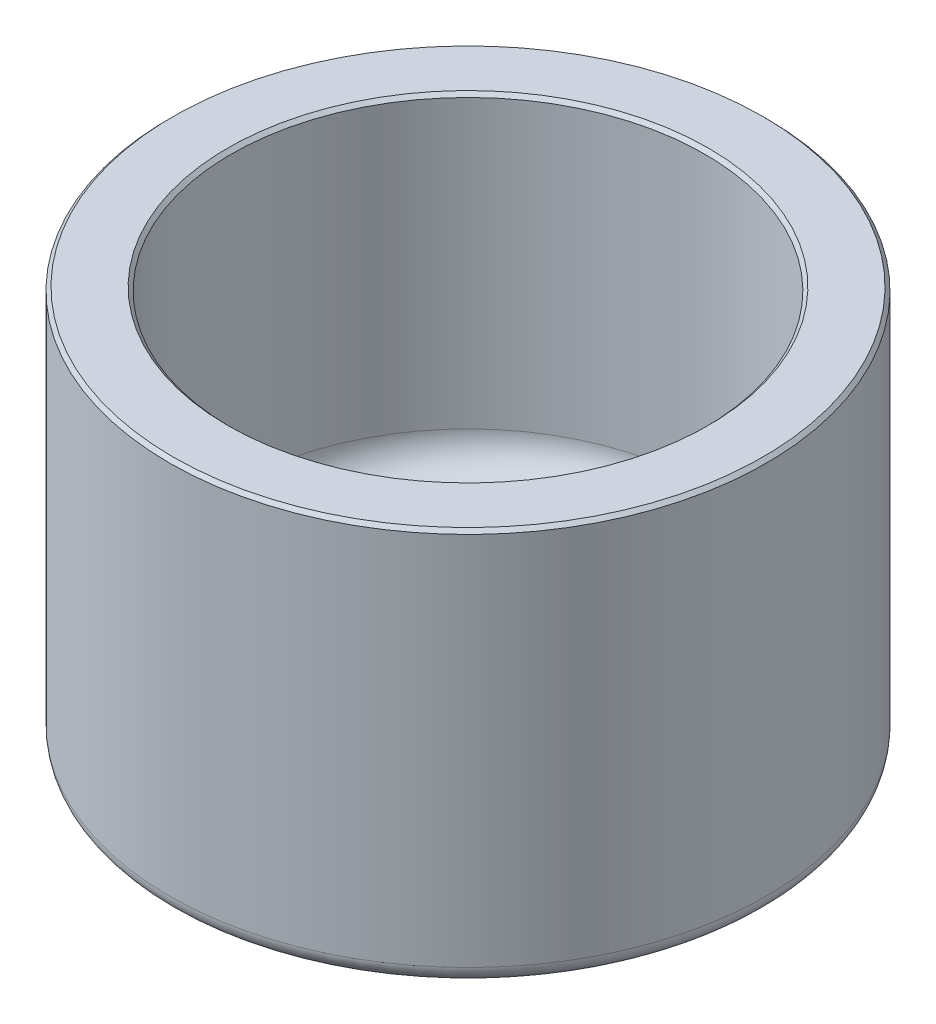
ISO-10303-21;
HEADER;
FILE_DESCRIPTION(('STEP AP214'),'2;1');
FILE_NAME('part.step','',(''),(''),'','','');
FILE_SCHEMA(('AUTOMOTIVE_DESIGN { 1 0 10303 214 1 1 1 1 }'));
ENDSEC;
DATA;
#1=APPLICATION_CONTEXT('core data for automotive mechanical design processes');
#2=APPLICATION_PROTOCOL_DEFINITION('international standard','automotive_design',2000,#1);
#3=PRODUCT_CONTEXT('',#1,'mechanical');
#4=PRODUCT('Part','Part','',(#3));
#5=PRODUCT_RELATED_PRODUCT_CATEGORY('part','',(#4));
#6=PRODUCT_DEFINITION_FORMATION('','',#4);
#7=PRODUCT_DEFINITION_CONTEXT('part definition',#1,'design');
#8=PRODUCT_DEFINITION('design','',#6,#7);
#9=PRODUCT_DEFINITION_SHAPE('','',#8);
#10=(LENGTH_UNIT() NAMED_UNIT(*) SI_UNIT(.MILLI.,.METRE.));
#11=(NAMED_UNIT(*) PLANE_ANGLE_UNIT() SI_UNIT($,.RADIAN.));
#12=(NAMED_UNIT(*) SI_UNIT($,.STERADIAN.) SOLID_ANGLE_UNIT());
#13=UNCERTAINTY_MEASURE_WITH_UNIT(LENGTH_MEASURE(1.E-05),#10,'distance_accuracy_value','');
#14=(GEOMETRIC_REPRESENTATION_CONTEXT(3) GLOBAL_UNCERTAINTY_ASSIGNED_CONTEXT((#13)) GLOBAL_UNIT_ASSIGNED_CONTEXT((#10,
#11,#12)) REPRESENTATION_CONTEXT('',''));
#15=CARTESIAN_POINT('',(0.,0.,0.));
#16=DIRECTION('',(0.,0.,1.));
#17=DIRECTION('',(1.,0.,0.));
#18=AXIS2_PLACEMENT_3D('',#15,#16,#17);
#19=CARTESIAN_POINT('',(0.,0.,0.));
#20=DIRECTION('',(0.,-1.,0.));
#21=DIRECTION('',(0.,0.,-1.));
#22=AXIS2_PLACEMENT_3D('',#19,#20,#21);
#23=PLANE('',#22);
#24=CARTESIAN_POINT('',(0.,0.,0.));
#25=DIRECTION('',(0.,-1.,0.));
#26=DIRECTION('',(0.,0.,-1.));
#27=AXIS2_PLACEMENT_3D('',#24,#25,#26);
#28=CIRCLE('',#27,15.95);
#29=CARTESIAN_POINT('',(0.,0.,-15.95));
#30=VERTEX_POINT('',#29);
#31=EDGE_CURVE('E58',#30,#30,#28,.T.);
#32=ORIENTED_EDGE('',*,*,#31,.T.);
#33=EDGE_LOOP('',(#32));
#34=FACE_BOUND('',#33,.T.);
#35=ADVANCED_FACE('F32',(#34),#23,.T.);
#36=CARTESIAN_POINT('',(0.,4.,0.));
#37=DIRECTION('',(0.,1.,0.));
#38=DIRECTION('',(0.,0.,1.));
#39=AXIS2_PLACEMENT_3D('',#36,#37,#38);
#40=CYLINDRICAL_SURFACE('',#39,16.95);
#41=CARTESIAN_POINT('',(0.,22.3,0.));
#42=DIRECTION('',(0.,1.,0.));
#43=DIRECTION('',(0.,0.,1.));
#44=AXIS2_PLACEMENT_3D('',#41,#42,#43);
#45=CIRCLE('',#44,16.95);
#46=CARTESIAN_POINT('',(0.,22.3,16.95));
#47=VERTEX_POINT('',#46);
#48=EDGE_CURVE('E10',#47,#47,#45,.F.);
#49=ORIENTED_EDGE('',*,*,#48,.T.);
#50=EDGE_LOOP('',(#49));
#51=FACE_BOUND('',#50,.T.);
#52=CARTESIAN_POINT('',(0.,0.999999999999999,0.));
#53=DIRECTION('',(0.,-1.,0.));
#54=DIRECTION('',(0.,0.,-1.));
#55=AXIS2_PLACEMENT_3D('',#52,#53,#54);
#56=CIRCLE('',#55,16.95);
#57=CARTESIAN_POINT('',(0.,0.999999999999999,-16.95));
#58=VERTEX_POINT('',#57);
#59=EDGE_CURVE('E61',#58,#58,#56,.F.);
#60=ORIENTED_EDGE('',*,*,#59,.T.);
#61=EDGE_LOOP('',(#60));
#62=FACE_BOUND('',#61,.T.);
#63=ADVANCED_FACE('F65',(#51,#62),#40,.T.);
#64=CARTESIAN_POINT('',(-16.95,22.5,0.));
#65=DIRECTION('',(0.,1.,0.));
#66=DIRECTION('',(0.,0.,1.));
#67=AXIS2_PLACEMENT_3D('',#64,#65,#66);
#68=PLANE('',#67);
#69=CARTESIAN_POINT('',(0.,22.5,0.));
#70=DIRECTION('',(0.,1.,0.));
#71=DIRECTION('',(0.,0.,1.));
#72=AXIS2_PLACEMENT_3D('',#69,#70,#71);
#73=CIRCLE('',#72,13.65);
#74=CARTESIAN_POINT('',(0.,22.5,13.65));
#75=VERTEX_POINT('',#74);
#76=EDGE_CURVE('E39',#75,#75,#73,.F.);
#77=ORIENTED_EDGE('',*,*,#76,.T.);
#78=EDGE_LOOP('',(#77));
#79=FACE_BOUND('',#78,.T.);
#80=CARTESIAN_POINT('',(0.,22.5,0.));
#81=DIRECTION('',(0.,1.,0.));
#82=DIRECTION('',(0.,0.,1.));
#83=AXIS2_PLACEMENT_3D('',#80,#81,#82);
#84=CIRCLE('',#83,16.75);
#85=CARTESIAN_POINT('',(0.,22.5,16.75));
#86=VERTEX_POINT('',#85);
#87=EDGE_CURVE('E43',#86,#86,#84,.T.);
#88=ORIENTED_EDGE('',*,*,#87,.T.);
#89=EDGE_LOOP('',(#88));
#90=FACE_BOUND('',#89,.T.);
#91=ADVANCED_FACE('F90',(#79,#90),#68,.T.);
#92=CARTESIAN_POINT('',(0.,4.,0.));
#93=DIRECTION('',(0.,1.,0.));
#94=DIRECTION('',(0.,0.,1.));
#95=AXIS2_PLACEMENT_3D('',#92,#93,#94);
#96=CYLINDRICAL_SURFACE('',#95,13.45);
#97=CARTESIAN_POINT('',(0.,22.3,0.));
#98=DIRECTION('',(0.,1.,0.));
#99=DIRECTION('',(0.,0.,1.));
#100=AXIS2_PLACEMENT_3D('',#97,#98,#99);
#101=CIRCLE('',#100,13.45);
#102=CARTESIAN_POINT('',(0.,22.3,13.45));
#103=VERTEX_POINT('',#102);
#104=EDGE_CURVE('E47',#103,#103,#101,.T.);
#105=ORIENTED_EDGE('',*,*,#104,.T.);
#106=EDGE_LOOP('',(#105));
#107=FACE_BOUND('',#106,.T.);
#108=CARTESIAN_POINT('',(0.,6.,0.));
#109=DIRECTION('',(0.,1.,0.));
#110=DIRECTION('',(0.,0.,1.));
#111=AXIS2_PLACEMENT_3D('',#108,#109,#110);
#112=CIRCLE('',#111,13.45);
#113=CARTESIAN_POINT('',(0.,6.,13.45));
#114=VERTEX_POINT('',#113);
#115=EDGE_CURVE('E52',#114,#114,#112,.F.);
#116=ORIENTED_EDGE('',*,*,#115,.T.);
#117=EDGE_LOOP('',(#116));
#118=FACE_BOUND('',#117,.T.);
#119=ADVANCED_FACE('F80',(#107,#118),#96,.F.);
#120=CARTESIAN_POINT('',(-13.45,4.,0.));
#121=DIRECTION('',(0.,1.,0.));
#122=DIRECTION('',(0.,0.,1.));
#123=AXIS2_PLACEMENT_3D('',#120,#121,#122);
#124=PLANE('',#123);
#125=CARTESIAN_POINT('',(0.,4.,0.));
#126=DIRECTION('',(0.,1.,0.));
#127=DIRECTION('',(0.,0.,1.));
#128=AXIS2_PLACEMENT_3D('',#125,#126,#127);
#129=CIRCLE('',#128,11.45);
#130=CARTESIAN_POINT('',(0.,4.,11.45));
#131=VERTEX_POINT('',#130);
#132=EDGE_CURVE('E55',#131,#131,#129,.T.);
#133=ORIENTED_EDGE('',*,*,#132,.T.);
#134=EDGE_LOOP('',(#133));
#135=FACE_BOUND('',#134,.T.);
#136=ADVANCED_FACE('F70',(#135),#124,.T.);
#137=CARTESIAN_POINT('',(0.,0.999999999999999,0.));
#138=DIRECTION('',(0.,-1.,0.));
#139=DIRECTION('',(0.,0.,-1.));
#140=AXIS2_PLACEMENT_3D('',#137,#138,#139);
#141=TOROIDAL_SURFACE('',#140,15.95,1.);
#142=ORIENTED_EDGE('',*,*,#31,.F.);
#143=EDGE_LOOP('',(#142));
#144=FACE_BOUND('',#143,.T.);
#145=ORIENTED_EDGE('',*,*,#59,.F.);
#146=EDGE_LOOP('',(#145));
#147=FACE_BOUND('',#146,.T.);
#148=ADVANCED_FACE('F67',(#144,#147),#141,.T.);
#149=CARTESIAN_POINT('',(0.,6.,0.));
#150=DIRECTION('',(0.,1.,0.));
#151=DIRECTION('',(0.,0.,1.));
#152=AXIS2_PLACEMENT_3D('',#149,#150,#151);
#153=TOROIDAL_SURFACE('',#152,11.45,2.);
#154=ORIENTED_EDGE('',*,*,#115,.F.);
#155=EDGE_LOOP('',(#154));
#156=FACE_BOUND('',#155,.T.);
#157=ORIENTED_EDGE('',*,*,#132,.F.);
#158=EDGE_LOOP('',(#157));
#159=FACE_BOUND('',#158,.T.);
#160=ADVANCED_FACE('F69',(#156,#159),#153,.F.);
#161=CARTESIAN_POINT('',(0.,22.3,0.));
#162=DIRECTION('',(0.,1.,0.));
#163=DIRECTION('',(0.,0.,1.));
#164=AXIS2_PLACEMENT_3D('',#161,#162,#163);
#165=CONICAL_SURFACE('',#164,13.45,0.785398163397457);
#166=CARTESIAN_POINT('',(0.,22.5,13.65));
#167=CARTESIAN_POINT('',(0.,22.4979166666667,13.6479166666666));
#168=CARTESIAN_POINT('',(0.,22.4958333333333,13.6458333333333));
#169=CARTESIAN_POINT('',(0.,22.4916666666667,13.6416666666666));
#170=CARTESIAN_POINT('',(0.,22.4895833333333,13.6395833333333));
#171=CARTESIAN_POINT('',(0.,22.4854166666667,13.6354166666666));
#172=CARTESIAN_POINT('',(0.,22.4833333333333,13.6333333333333));
#173=CARTESIAN_POINT('',(0.,22.4791666666667,13.6291666666666));
#174=CARTESIAN_POINT('',(0.,22.4770833333333,13.6270833333333));
#175=CARTESIAN_POINT('',(0.,22.4729166666667,13.6229166666666));
#176=CARTESIAN_POINT('',(0.,22.4708333333333,13.6208333333333));
#177=CARTESIAN_POINT('',(0.,22.4666666666667,13.6166666666666));
#178=CARTESIAN_POINT('',(0.,22.4645833333333,13.6145833333333));
#179=CARTESIAN_POINT('',(0.,22.4604166666667,13.6104166666667));
#180=CARTESIAN_POINT('',(0.,22.4583333333333,13.6083333333333));
#181=CARTESIAN_POINT('',(0.,22.4541666666667,13.6041666666667));
#182=CARTESIAN_POINT('',(0.,22.4520833333333,13.6020833333333));
#183=CARTESIAN_POINT('',(0.,22.4479166666667,13.5979166666667));
#184=CARTESIAN_POINT('',(0.,22.4458333333333,13.5958333333333));
#185=CARTESIAN_POINT('',(0.,22.4416666666667,13.5916666666667));
#186=CARTESIAN_POINT('',(0.,22.4395833333333,13.5895833333333));
#187=CARTESIAN_POINT('',(0.,22.4354166666667,13.5854166666667));
#188=CARTESIAN_POINT('',(0.,22.4333333333333,13.5833333333333));
#189=CARTESIAN_POINT('',(0.,22.4291666666667,13.5791666666667));
#190=CARTESIAN_POINT('',(0.,22.4270833333333,13.5770833333333));
#191=CARTESIAN_POINT('',(0.,22.4229166666667,13.5729166666667));
#192=CARTESIAN_POINT('',(0.,22.4208333333333,13.5708333333333));
#193=CARTESIAN_POINT('',(0.,22.4166666666667,13.5666666666667));
#194=CARTESIAN_POINT('',(0.,22.4145833333333,13.5645833333333));
#195=CARTESIAN_POINT('',(0.,22.4104166666667,13.5604166666667));
#196=CARTESIAN_POINT('',(0.,22.4083333333333,13.5583333333333));
#197=CARTESIAN_POINT('',(0.,22.4041666666667,13.5541666666667));
#198=CARTESIAN_POINT('',(0.,22.4020833333333,13.5520833333333));
#199=CARTESIAN_POINT('',(0.,22.3979166666667,13.5479166666667));
#200=CARTESIAN_POINT('',(0.,22.3958333333333,13.5458333333333));
#201=CARTESIAN_POINT('',(0.,22.3916666666667,13.5416666666667));
#202=CARTESIAN_POINT('',(0.,22.3895833333333,13.5395833333333));
#203=CARTESIAN_POINT('',(0.,22.3854166666667,13.5354166666667));
#204=CARTESIAN_POINT('',(0.,22.3833333333333,13.5333333333333));
#205=CARTESIAN_POINT('',(0.,22.3791666666667,13.5291666666667));
#206=CARTESIAN_POINT('',(0.,22.3770833333333,13.5270833333333));
#207=CARTESIAN_POINT('',(0.,22.3729166666667,13.5229166666667));
#208=CARTESIAN_POINT('',(0.,22.3708333333333,13.5208333333333));
#209=CARTESIAN_POINT('',(0.,22.3666666666667,13.5166666666667));
#210=CARTESIAN_POINT('',(0.,22.3645833333333,13.5145833333333));
#211=CARTESIAN_POINT('',(0.,22.3604166666667,13.5104166666667));
#212=CARTESIAN_POINT('',(0.,22.3583333333333,13.5083333333333));
#213=CARTESIAN_POINT('',(0.,22.3541666666667,13.5041666666667));
#214=CARTESIAN_POINT('',(0.,22.3520833333333,13.5020833333333));
#215=CARTESIAN_POINT('',(0.,22.3479166666667,13.4979166666667));
#216=CARTESIAN_POINT('',(0.,22.3458333333333,13.4958333333333));
#217=CARTESIAN_POINT('',(0.,22.3416666666667,13.4916666666667));
#218=CARTESIAN_POINT('',(0.,22.3395833333333,13.4895833333333));
#219=CARTESIAN_POINT('',(0.,22.3354166666667,13.4854166666667));
#220=CARTESIAN_POINT('',(0.,22.3333333333333,13.4833333333333));
#221=CARTESIAN_POINT('',(0.,22.3291666666667,13.4791666666667));
#222=CARTESIAN_POINT('',(0.,22.3270833333333,13.4770833333333));
#223=CARTESIAN_POINT('',(0.,22.3229166666667,13.4729166666667));
#224=CARTESIAN_POINT('',(0.,22.3208333333333,13.4708333333333));
#225=CARTESIAN_POINT('',(0.,22.3166666666667,13.4666666666667));
#226=CARTESIAN_POINT('',(0.,22.3145833333333,13.4645833333333));
#227=CARTESIAN_POINT('',(0.,22.3104166666667,13.4604166666667));
#228=CARTESIAN_POINT('',(0.,22.3083333333333,13.4583333333333));
#229=CARTESIAN_POINT('',(0.,22.3041666666667,13.4541666666667));
#230=CARTESIAN_POINT('',(0.,22.3020833333333,13.4520833333333));
#231=CARTESIAN_POINT('',(0.,22.3,13.45));
#232=B_SPLINE_CURVE_WITH_KNOTS('',3,(#166,#167,#168,#169,#170,#171,#172,#173,#174,#175,#176,
#177,#178,#179,#180,#181,#182,#183,#184,#185,#186,#187,#188,#189,#190,#191,#192,#193,#194,#195,
#196,#197,#198,#199,#200,#201,#202,#203,#204,#205,#206,#207,#208,#209,#210,#211,#212,#213,#214,
#215,#216,#217,#218,#219,#220,#221,#222,#223,#224,#225,#226,#227,#228,#229,#230,#231),
.UNSPECIFIED.,.F.,.F.,(4,2,2,2,2,2,2,2,2,2,2,2,2,2,2,2,2,2,2,2,2,2,2,2,2,2,2,2,2,2,2,2,4),(0.,
0.00883883476483087,0.0176776695296617,0.0265165042944926,0.0353553390593235,0.0441941738241543,
0.0530330085889852,0.0618718433538161,0.070710678118647,0.079549512883479,0.0883883476483099,
0.0972271824131408,0.106066017177974,0.114904851942803,0.123743686707633,0.132582521472464,
0.141421356237295,0.150260191002126,0.159099025766957,0.167937860531788,0.176776695296619,
0.18561553006145,0.19445436482628,0.203293199591111,0.212132034355945,0.220970869120777,
0.229809703885608,0.238648538650438,0.247487373415269,0.2563262081801,0.265165042944931,
0.274003877709762,0.28284271247459),.UNSPECIFIED.);
#233=EDGE_CURVE('BSEAM77',#75,#103,#232,.T.);
#234=ORIENTED_EDGE('',*,*,#76,.F.);
#235=ORIENTED_EDGE('',*,*,#104,.F.);
#236=ORIENTED_EDGE('',*,*,#233,.T.);
#237=ORIENTED_EDGE('',*,*,#233,.F.);
#238=EDGE_LOOP('',(#234,#236,#235,#237));
#239=FACE_BOUND('',#238,.T.);
#240=ADVANCED_FACE('F77',(#239),#165,.F.);
#241=CARTESIAN_POINT('',(0.,22.5,0.));
#242=DIRECTION('',(0.,-1.,0.));
#243=DIRECTION('',(0.,0.,-1.));
#244=AXIS2_PLACEMENT_3D('',#241,#242,#243);
#245=CONICAL_SURFACE('',#244,16.75,0.785398163397448);
#246=ORIENTED_EDGE('',*,*,#48,.F.);
#247=EDGE_LOOP('',(#246));
#248=FACE_BOUND('',#247,.T.);
#249=ORIENTED_EDGE('',*,*,#87,.F.);
#250=EDGE_LOOP('',(#249));
#251=FACE_BOUND('',#250,.T.);
#252=ADVANCED_FACE('F34',(#248,#251),#245,.T.);
#253=CLOSED_SHELL('',(#35,#63,#91,#119,#136,#148,#160,#240,#252));
#254=MANIFOLD_SOLID_BREP('B2',#253);
#255=ADVANCED_BREP_SHAPE_REPRESENTATION('',(#18,#254),#14);
#256=SHAPE_DEFINITION_REPRESENTATION(#9,#255);
ENDSEC;
END-ISO-10303-21;
